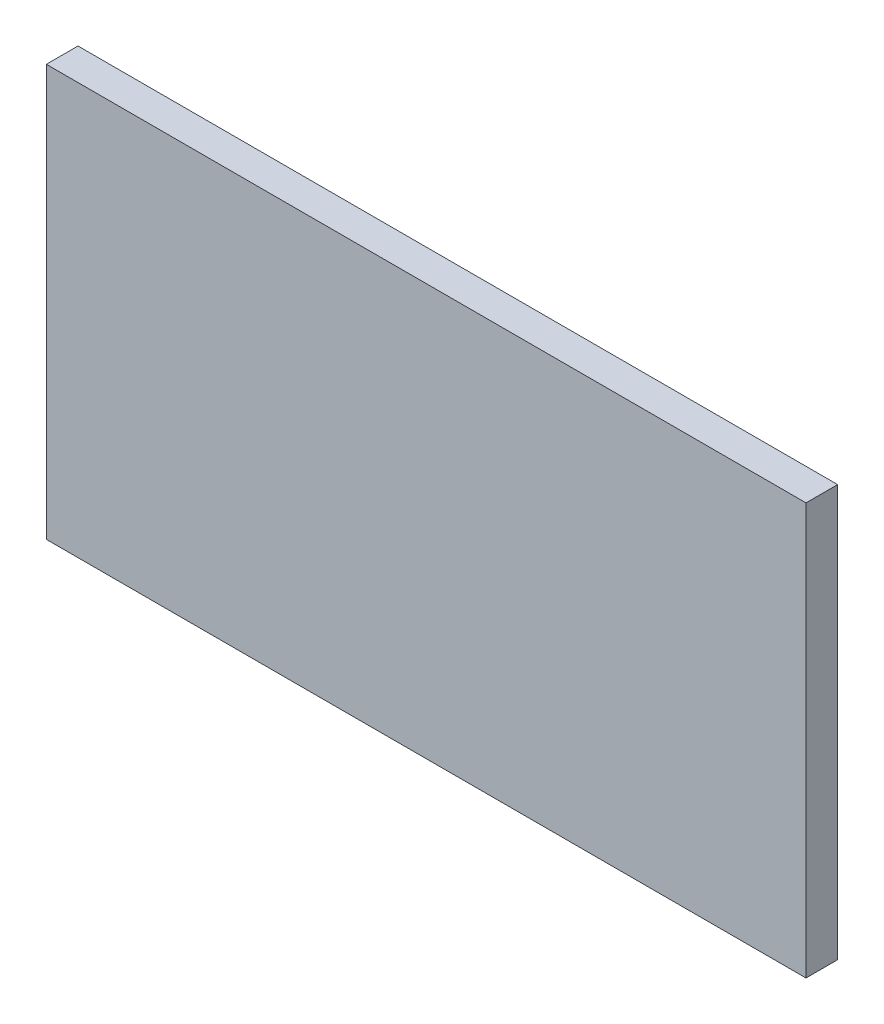
ISO-10303-21;
HEADER;
FILE_DESCRIPTION(('STEP AP214'),'2;1');
FILE_NAME('part.step','',(''),(''),'','','');
FILE_SCHEMA(('AUTOMOTIVE_DESIGN { 1 0 10303 214 1 1 1 1 }'));
ENDSEC;
DATA;
#1=APPLICATION_CONTEXT('core data for automotive mechanical design processes');
#2=APPLICATION_PROTOCOL_DEFINITION('international standard','automotive_design',2000,#1);
#3=PRODUCT_CONTEXT('',#1,'mechanical');
#4=PRODUCT('Part','Part','',(#3));
#5=PRODUCT_RELATED_PRODUCT_CATEGORY('part','',(#4));
#6=PRODUCT_DEFINITION_FORMATION('','',#4);
#7=PRODUCT_DEFINITION_CONTEXT('part definition',#1,'design');
#8=PRODUCT_DEFINITION('design','',#6,#7);
#9=PRODUCT_DEFINITION_SHAPE('','',#8);
#10=(LENGTH_UNIT() NAMED_UNIT(*) SI_UNIT(.MILLI.,.METRE.));
#11=(NAMED_UNIT(*) PLANE_ANGLE_UNIT() SI_UNIT($,.RADIAN.));
#12=(NAMED_UNIT(*) SI_UNIT($,.STERADIAN.) SOLID_ANGLE_UNIT());
#13=UNCERTAINTY_MEASURE_WITH_UNIT(LENGTH_MEASURE(1.E-05),#10,'distance_accuracy_value','');
#14=(GEOMETRIC_REPRESENTATION_CONTEXT(3) GLOBAL_UNCERTAINTY_ASSIGNED_CONTEXT((#13)) GLOBAL_UNIT_ASSIGNED_CONTEXT((#10,
#11,#12)) REPRESENTATION_CONTEXT('',''));
#15=CARTESIAN_POINT('',(0.,0.,0.));
#16=DIRECTION('',(0.,0.,1.));
#17=DIRECTION('',(1.,0.,0.));
#18=AXIS2_PLACEMENT_3D('',#15,#16,#17);
#19=CARTESIAN_POINT('',(0.,0.,1.));
#20=DIRECTION('',(-1.,0.,0.));
#21=DIRECTION('',(0.,-1.,0.));
#22=AXIS2_PLACEMENT_3D('',#19,#20,#21);
#23=PLANE('',#22);
#24=DIRECTION('',(0.,1.,0.));
#25=VECTOR('',#24,1.);
#26=CARTESIAN_POINT('',(0.,0.,0.));
#27=LINE('',#26,#25);
#28=CARTESIAN_POINT('',(0.,0.,0.));
#29=VERTEX_POINT('',#28);
#30=CARTESIAN_POINT('',(0.,13.,0.));
#31=VERTEX_POINT('',#30);
#32=EDGE_CURVE('E100',#29,#31,#27,.T.);
#33=ORIENTED_EDGE('',*,*,#32,.T.);
#34=DIRECTION('',(0.,0.,-1.));
#35=VECTOR('',#34,1.);
#36=CARTESIAN_POINT('',(0.,13.,1.));
#37=LINE('',#36,#35);
#38=CARTESIAN_POINT('',(0.,13.,1.));
#39=VERTEX_POINT('',#38);
#40=EDGE_CURVE('E11',#39,#31,#37,.T.);
#41=ORIENTED_EDGE('',*,*,#40,.F.);
#42=DIRECTION('',(0.,1.,0.));
#43=VECTOR('',#42,1.);
#44=CARTESIAN_POINT('',(0.,0.,1.));
#45=LINE('',#44,#43);
#46=CARTESIAN_POINT('',(0.,0.,1.));
#47=VERTEX_POINT('',#46);
#48=EDGE_CURVE('E88',#47,#39,#45,.T.);
#49=ORIENTED_EDGE('',*,*,#48,.F.);
#50=DIRECTION('',(0.,0.,-1.));
#51=VECTOR('',#50,1.);
#52=CARTESIAN_POINT('',(0.,0.,1.));
#53=LINE('',#52,#51);
#54=EDGE_CURVE('E96',#47,#29,#53,.T.);
#55=ORIENTED_EDGE('',*,*,#54,.T.);
#56=EDGE_LOOP('',(#33,#41,#49,#55));
#57=FACE_BOUND('',#56,.T.);
#58=ADVANCED_FACE('F37',(#57),#23,.F.);
#59=CARTESIAN_POINT('',(0.,13.,1.));
#60=DIRECTION('',(0.,-1.,0.));
#61=DIRECTION('',(1.,0.,0.));
#62=AXIS2_PLACEMENT_3D('',#59,#60,#61);
#63=PLANE('',#62);
#64=DIRECTION('',(-1.,0.,0.));
#65=VECTOR('',#64,1.);
#66=CARTESIAN_POINT('',(0.,13.,0.));
#67=LINE('',#66,#65);
#68=CARTESIAN_POINT('',(-24.,13.,0.));
#69=VERTEX_POINT('',#68);
#70=EDGE_CURVE('E92',#31,#69,#67,.T.);
#71=ORIENTED_EDGE('',*,*,#70,.T.);
#72=DIRECTION('',(0.,0.,-1.));
#73=VECTOR('',#72,1.);
#74=CARTESIAN_POINT('',(-24.,13.,1.));
#75=LINE('',#74,#73);
#76=CARTESIAN_POINT('',(-24.,13.,1.));
#77=VERTEX_POINT('',#76);
#78=EDGE_CURVE('E45',#77,#69,#75,.T.);
#79=ORIENTED_EDGE('',*,*,#78,.F.);
#80=DIRECTION('',(-1.,0.,0.));
#81=VECTOR('',#80,1.);
#82=CARTESIAN_POINT('',(0.,13.,1.));
#83=LINE('',#82,#81);
#84=EDGE_CURVE('E83',#39,#77,#83,.T.);
#85=ORIENTED_EDGE('',*,*,#84,.F.);
#86=ORIENTED_EDGE('',*,*,#40,.T.);
#87=EDGE_LOOP('',(#71,#79,#85,#86));
#88=FACE_BOUND('',#87,.T.);
#89=ADVANCED_FACE('F91',(#88),#63,.F.);
#90=CARTESIAN_POINT('',(-24.,0.,1.));
#91=DIRECTION('',(1.,0.,0.));
#92=DIRECTION('',(0.,0.,-1.));
#93=AXIS2_PLACEMENT_3D('',#90,#91,#92);
#94=PLANE('',#93);
#95=DIRECTION('',(0.,-1.,0.));
#96=VECTOR('',#95,1.);
#97=CARTESIAN_POINT('',(-24.,0.,0.));
#98=LINE('',#97,#96);
#99=CARTESIAN_POINT('',(-24.,0.,0.));
#100=VERTEX_POINT('',#99);
#101=EDGE_CURVE('E70',#69,#100,#98,.T.);
#102=ORIENTED_EDGE('',*,*,#101,.T.);
#103=DIRECTION('',(0.,0.,-1.));
#104=VECTOR('',#103,1.);
#105=CARTESIAN_POINT('',(-24.,0.,1.));
#106=LINE('',#105,#104);
#107=CARTESIAN_POINT('',(-24.,0.,1.));
#108=VERTEX_POINT('',#107);
#109=EDGE_CURVE('E93',#108,#100,#106,.T.);
#110=ORIENTED_EDGE('',*,*,#109,.F.);
#111=DIRECTION('',(0.,-1.,0.));
#112=VECTOR('',#111,1.);
#113=CARTESIAN_POINT('',(-24.,0.,1.));
#114=LINE('',#113,#112);
#115=EDGE_CURVE('E86',#77,#108,#114,.T.);
#116=ORIENTED_EDGE('',*,*,#115,.F.);
#117=ORIENTED_EDGE('',*,*,#78,.T.);
#118=EDGE_LOOP('',(#102,#110,#116,#117));
#119=FACE_BOUND('',#118,.T.);
#120=ADVANCED_FACE('F94',(#119),#94,.F.);
#121=CARTESIAN_POINT('',(0.,0.,1.));
#122=DIRECTION('',(0.,1.,0.));
#123=DIRECTION('',(-1.,0.,0.));
#124=AXIS2_PLACEMENT_3D('',#121,#122,#123);
#125=PLANE('',#124);
#126=DIRECTION('',(1.,0.,0.));
#127=VECTOR('',#126,1.);
#128=CARTESIAN_POINT('',(0.,0.,0.));
#129=LINE('',#128,#127);
#130=EDGE_CURVE('E76',#100,#29,#129,.T.);
#131=ORIENTED_EDGE('',*,*,#130,.T.);
#132=ORIENTED_EDGE('',*,*,#54,.F.);
#133=DIRECTION('',(1.,0.,0.));
#134=VECTOR('',#133,1.);
#135=CARTESIAN_POINT('',(0.,0.,1.));
#136=LINE('',#135,#134);
#137=EDGE_CURVE('E53',#108,#47,#136,.T.);
#138=ORIENTED_EDGE('',*,*,#137,.F.);
#139=ORIENTED_EDGE('',*,*,#109,.T.);
#140=EDGE_LOOP('',(#131,#132,#138,#139));
#141=FACE_BOUND('',#140,.T.);
#142=ADVANCED_FACE('F107',(#141),#125,.F.);
#143=CARTESIAN_POINT('',(0.,0.,1.));
#144=DIRECTION('',(0.,0.,1.));
#145=DIRECTION('',(1.,0.,0.));
#146=AXIS2_PLACEMENT_3D('',#143,#144,#145);
#147=PLANE('',#146);
#148=ORIENTED_EDGE('',*,*,#48,.T.);
#149=ORIENTED_EDGE('',*,*,#84,.T.);
#150=ORIENTED_EDGE('',*,*,#115,.T.);
#151=ORIENTED_EDGE('',*,*,#137,.T.);
#152=EDGE_LOOP('',(#148,#149,#150,#151));
#153=FACE_BOUND('',#152,.T.);
#154=ADVANCED_FACE('F84',(#153),#147,.T.);
#155=CARTESIAN_POINT('',(0.,0.,0.));
#156=DIRECTION('',(0.,0.,1.));
#157=DIRECTION('',(1.,0.,0.));
#158=AXIS2_PLACEMENT_3D('',#155,#156,#157);
#159=PLANE('',#158);
#160=ORIENTED_EDGE('',*,*,#32,.F.);
#161=ORIENTED_EDGE('',*,*,#130,.F.);
#162=ORIENTED_EDGE('',*,*,#101,.F.);
#163=ORIENTED_EDGE('',*,*,#70,.F.);
#164=EDGE_LOOP('',(#160,#161,#162,#163));
#165=FACE_BOUND('',#164,.T.);
#166=ADVANCED_FACE('F110',(#165),#159,.F.);
#167=CLOSED_SHELL('',(#58,#89,#120,#142,#154,#166));
#168=MANIFOLD_SOLID_BREP('B2',#167);
#169=ADVANCED_BREP_SHAPE_REPRESENTATION('',(#18,#168),#14);
#170=SHAPE_DEFINITION_REPRESENTATION(#9,#169);
ENDSEC;
END-ISO-10303-21;
